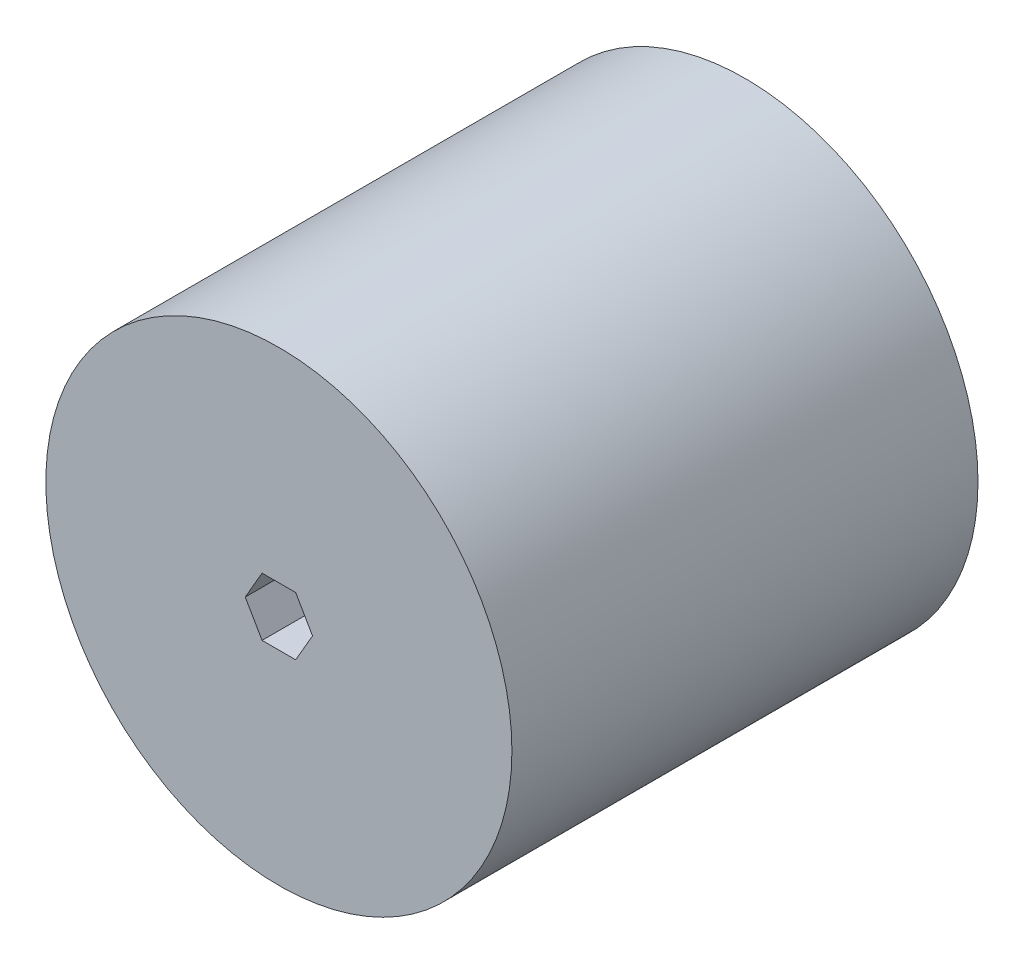
ISO-10303-21;
HEADER;
FILE_DESCRIPTION(('STEP AP214'),'2;1');
FILE_NAME('part.step','',(''),(''),'','','');
FILE_SCHEMA(('AUTOMOTIVE_DESIGN { 1 0 10303 214 1 1 1 1 }'));
ENDSEC;
DATA;
#1=APPLICATION_CONTEXT('core data for automotive mechanical design processes');
#2=APPLICATION_PROTOCOL_DEFINITION('international standard','automotive_design',2000,#1);
#3=PRODUCT_CONTEXT('',#1,'mechanical');
#4=PRODUCT('Part','Part','',(#3));
#5=PRODUCT_RELATED_PRODUCT_CATEGORY('part','',(#4));
#6=PRODUCT_DEFINITION_FORMATION('','',#4);
#7=PRODUCT_DEFINITION_CONTEXT('part definition',#1,'design');
#8=PRODUCT_DEFINITION('design','',#6,#7);
#9=PRODUCT_DEFINITION_SHAPE('','',#8);
#10=(LENGTH_UNIT() NAMED_UNIT(*) SI_UNIT(.MILLI.,.METRE.));
#11=(NAMED_UNIT(*) PLANE_ANGLE_UNIT() SI_UNIT($,.RADIAN.));
#12=(NAMED_UNIT(*) SI_UNIT($,.STERADIAN.) SOLID_ANGLE_UNIT());
#13=UNCERTAINTY_MEASURE_WITH_UNIT(LENGTH_MEASURE(1.E-05),#10,'distance_accuracy_value','');
#14=(GEOMETRIC_REPRESENTATION_CONTEXT(3) GLOBAL_UNCERTAINTY_ASSIGNED_CONTEXT((#13)) GLOBAL_UNIT_ASSIGNED_CONTEXT((#10,
#11,#12)) REPRESENTATION_CONTEXT('',''));
#15=CARTESIAN_POINT('',(0.,0.,0.));
#16=DIRECTION('',(0.,0.,1.));
#17=DIRECTION('',(1.,0.,0.));
#18=AXIS2_PLACEMENT_3D('',#15,#16,#17);
#19=CARTESIAN_POINT('',(0.,0.,101.6));
#20=DIRECTION('',(0.,0.,1.));
#21=DIRECTION('',(1.,0.,0.));
#22=AXIS2_PLACEMENT_3D('',#19,#20,#21);
#23=PLANE('',#22);
#24=CARTESIAN_POINT('',(0.,0.,101.6));
#25=DIRECTION('',(0.,0.,1.));
#26=DIRECTION('',(1.,0.,0.));
#27=AXIS2_PLACEMENT_3D('',#24,#25,#26);
#28=CIRCLE('',#27,50.8);
#29=CARTESIAN_POINT('',(50.8,0.,101.6));
#30=VERTEX_POINT('',#29);
#31=EDGE_CURVE('E11',#30,#30,#28,.T.);
#32=ORIENTED_EDGE('',*,*,#31,.T.);
#33=EDGE_LOOP('',(#32));
#34=FACE_BOUND('',#33,.T.);
#35=DIRECTION('',(0.500000000000001,-0.866025403784438,0.));
#36=VECTOR('',#35,1.);
#37=CARTESIAN_POINT('',(-7.33234841870825,0.,101.6));
#38=LINE('',#37,#36);
#39=CARTESIAN_POINT('',(-7.33234841870825,0.,101.6));
#40=VERTEX_POINT('',#39);
#41=CARTESIAN_POINT('',(-3.66617420935411,-6.35000000000001,101.6));
#42=VERTEX_POINT('',#41);
#43=EDGE_CURVE('E95',#40,#42,#38,.T.);
#44=ORIENTED_EDGE('',*,*,#43,.F.);
#45=DIRECTION('',(-0.499999999999995,-0.866025403784442,0.));
#46=VECTOR('',#45,1.);
#47=CARTESIAN_POINT('',(-3.6661742093542,6.34999999999996,101.6));
#48=LINE('',#47,#46);
#49=CARTESIAN_POINT('',(-3.6661742093542,6.34999999999996,101.6));
#50=VERTEX_POINT('',#49);
#51=EDGE_CURVE('E87',#50,#40,#48,.T.);
#52=ORIENTED_EDGE('',*,*,#51,.F.);
#53=DIRECTION('',(-1.,0.,0.));
#54=VECTOR('',#53,1.);
#55=CARTESIAN_POINT('',(3.66617420935407,6.35000000000003,101.6));
#56=LINE('',#55,#54);
#57=CARTESIAN_POINT('',(3.66617420935407,6.35000000000003,101.6));
#58=VERTEX_POINT('',#57);
#59=EDGE_CURVE('E115',#58,#50,#56,.T.);
#60=ORIENTED_EDGE('',*,*,#59,.F.);
#61=DIRECTION('',(-0.500000000000007,0.866025403784435,0.));
#62=VECTOR('',#61,1.);
#63=CARTESIAN_POINT('',(7.33234841870825,0.,101.6));
#64=LINE('',#63,#62);
#65=CARTESIAN_POINT('',(7.33234841870825,0.,101.6));
#66=VERTEX_POINT('',#65);
#67=EDGE_CURVE('E113',#66,#58,#64,.T.);
#68=ORIENTED_EDGE('',*,*,#67,.F.);
#69=DIRECTION('',(0.499999999999995,0.866025403784442,0.));
#70=VECTOR('',#69,1.);
#71=CARTESIAN_POINT('',(3.66617420935415,-6.34999999999998,101.6));
#72=LINE('',#71,#70);
#73=CARTESIAN_POINT('',(3.66617420935415,-6.34999999999998,101.6));
#74=VERTEX_POINT('',#73);
#75=EDGE_CURVE('E109',#74,#66,#72,.T.);
#76=ORIENTED_EDGE('',*,*,#75,.F.);
#77=DIRECTION('',(1.,0.,0.));
#78=VECTOR('',#77,1.);
#79=CARTESIAN_POINT('',(-3.66617420935411,-6.35000000000001,101.6));
#80=LINE('',#79,#78);
#81=EDGE_CURVE('E107',#42,#74,#80,.T.);
#82=ORIENTED_EDGE('',*,*,#81,.F.);
#83=EDGE_LOOP('',(#44,#52,#60,#68,#76,#82));
#84=FACE_BOUND('',#83,.T.);
#85=ADVANCED_FACE('F34',(#34,#84),#23,.T.);
#86=CARTESIAN_POINT('',(0.,0.,0.));
#87=DIRECTION('',(0.,0.,1.));
#88=DIRECTION('',(1.,0.,0.));
#89=AXIS2_PLACEMENT_3D('',#86,#87,#88);
#90=PLANE('',#89);
#91=CARTESIAN_POINT('',(0.,0.,0.));
#92=DIRECTION('',(0.,0.,1.));
#93=DIRECTION('',(1.,0.,0.));
#94=AXIS2_PLACEMENT_3D('',#91,#92,#93);
#95=CIRCLE('',#94,50.8);
#96=CARTESIAN_POINT('',(50.8,0.,0.));
#97=VERTEX_POINT('',#96);
#98=EDGE_CURVE('E38',#97,#97,#95,.T.);
#99=ORIENTED_EDGE('',*,*,#98,.F.);
#100=EDGE_LOOP('',(#99));
#101=FACE_BOUND('',#100,.T.);
#102=DIRECTION('',(-0.499999999999995,-0.866025403784442,0.));
#103=VECTOR('',#102,1.);
#104=CARTESIAN_POINT('',(-3.6661742093542,6.34999999999996,0.));
#105=LINE('',#104,#103);
#106=CARTESIAN_POINT('',(-3.6661742093542,6.34999999999996,0.));
#107=VERTEX_POINT('',#106);
#108=CARTESIAN_POINT('',(-7.33234841870825,0.,0.));
#109=VERTEX_POINT('',#108);
#110=EDGE_CURVE('E57',#107,#109,#105,.T.);
#111=ORIENTED_EDGE('',*,*,#110,.T.);
#112=DIRECTION('',(0.500000000000001,-0.866025403784438,0.));
#113=VECTOR('',#112,1.);
#114=CARTESIAN_POINT('',(-7.33234841870825,0.,0.));
#115=LINE('',#114,#113);
#116=CARTESIAN_POINT('',(-3.66617420935411,-6.35000000000001,0.));
#117=VERTEX_POINT('',#116);
#118=EDGE_CURVE('E102',#109,#117,#115,.T.);
#119=ORIENTED_EDGE('',*,*,#118,.T.);
#120=DIRECTION('',(1.,0.,0.));
#121=VECTOR('',#120,1.);
#122=CARTESIAN_POINT('',(-3.66617420935411,-6.35000000000001,0.));
#123=LINE('',#122,#121);
#124=CARTESIAN_POINT('',(3.66617420935415,-6.34999999999998,0.));
#125=VERTEX_POINT('',#124);
#126=EDGE_CURVE('E119',#117,#125,#123,.T.);
#127=ORIENTED_EDGE('',*,*,#126,.T.);
#128=DIRECTION('',(0.499999999999995,0.866025403784442,0.));
#129=VECTOR('',#128,1.);
#130=CARTESIAN_POINT('',(3.66617420935415,-6.34999999999998,0.));
#131=LINE('',#130,#129);
#132=CARTESIAN_POINT('',(7.33234841870825,0.,0.));
#133=VERTEX_POINT('',#132);
#134=EDGE_CURVE('E122',#125,#133,#131,.T.);
#135=ORIENTED_EDGE('',*,*,#134,.T.);
#136=DIRECTION('',(-0.500000000000007,0.866025403784435,0.));
#137=VECTOR('',#136,1.);
#138=CARTESIAN_POINT('',(7.33234841870825,0.,0.));
#139=LINE('',#138,#137);
#140=CARTESIAN_POINT('',(3.66617420935407,6.35000000000003,0.));
#141=VERTEX_POINT('',#140);
#142=EDGE_CURVE('E125',#133,#141,#139,.T.);
#143=ORIENTED_EDGE('',*,*,#142,.T.);
#144=DIRECTION('',(-1.,0.,0.));
#145=VECTOR('',#144,1.);
#146=CARTESIAN_POINT('',(3.66617420935407,6.35000000000003,0.));
#147=LINE('',#146,#145);
#148=EDGE_CURVE('E96',#141,#107,#147,.T.);
#149=ORIENTED_EDGE('',*,*,#148,.T.);
#150=EDGE_LOOP('',(#111,#119,#127,#135,#143,#149));
#151=FACE_BOUND('',#150,.T.);
#152=ADVANCED_FACE('F142',(#101,#151),#90,.F.);
#153=CARTESIAN_POINT('',(0.,0.,101.6));
#154=DIRECTION('',(0.,0.,-1.));
#155=DIRECTION('',(-1.,0.,0.));
#156=AXIS2_PLACEMENT_3D('',#153,#154,#155);
#157=CYLINDRICAL_SURFACE('',#156,50.8);
#158=ORIENTED_EDGE('',*,*,#31,.F.);
#159=EDGE_LOOP('',(#158));
#160=FACE_BOUND('',#159,.T.);
#161=ORIENTED_EDGE('',*,*,#98,.T.);
#162=EDGE_LOOP('',(#161));
#163=FACE_BOUND('',#162,.T.);
#164=ADVANCED_FACE('F36',(#160,#163),#157,.T.);
#165=CARTESIAN_POINT('',(-3.6661742093542,6.34999999999996,101.6));
#166=DIRECTION('',(0.866025403784442,-0.499999999999995,0.));
#167=DIRECTION('',(0.499999999999995,0.866025403784442,0.));
#168=AXIS2_PLACEMENT_3D('',#165,#166,#167);
#169=PLANE('',#168);
#170=ORIENTED_EDGE('',*,*,#110,.F.);
#171=DIRECTION('',(0.,0.,-1.));
#172=VECTOR('',#171,1.);
#173=CARTESIAN_POINT('',(-3.6661742093542,6.34999999999996,101.6));
#174=LINE('',#173,#172);
#175=EDGE_CURVE('E91',#50,#107,#174,.T.);
#176=ORIENTED_EDGE('',*,*,#175,.F.);
#177=ORIENTED_EDGE('',*,*,#51,.T.);
#178=DIRECTION('',(0.,0.,-1.));
#179=VECTOR('',#178,1.);
#180=CARTESIAN_POINT('',(-7.33234841870825,0.,101.6));
#181=LINE('',#180,#179);
#182=EDGE_CURVE('E90',#40,#109,#181,.T.);
#183=ORIENTED_EDGE('',*,*,#182,.T.);
#184=EDGE_LOOP('',(#170,#176,#177,#183));
#185=FACE_BOUND('',#184,.T.);
#186=ADVANCED_FACE('F89',(#185),#169,.T.);
#187=CARTESIAN_POINT('',(-7.33234841870825,0.,101.6));
#188=DIRECTION('',(0.866025403784438,0.500000000000001,0.));
#189=DIRECTION('',(-0.500000000000001,0.866025403784438,0.));
#190=AXIS2_PLACEMENT_3D('',#187,#188,#189);
#191=PLANE('',#190);
#192=ORIENTED_EDGE('',*,*,#118,.F.);
#193=ORIENTED_EDGE('',*,*,#182,.F.);
#194=ORIENTED_EDGE('',*,*,#43,.T.);
#195=DIRECTION('',(0.,0.,-1.));
#196=VECTOR('',#195,1.);
#197=CARTESIAN_POINT('',(-3.66617420935411,-6.35000000000001,101.6));
#198=LINE('',#197,#196);
#199=EDGE_CURVE('E103',#42,#117,#198,.T.);
#200=ORIENTED_EDGE('',*,*,#199,.T.);
#201=EDGE_LOOP('',(#192,#193,#194,#200));
#202=FACE_BOUND('',#201,.T.);
#203=ADVANCED_FACE('F99',(#202),#191,.T.);
#204=CARTESIAN_POINT('',(-3.66617420935411,-6.35000000000001,101.6));
#205=DIRECTION('',(0.,1.,0.));
#206=DIRECTION('',(-1.,0.,0.));
#207=AXIS2_PLACEMENT_3D('',#204,#205,#206);
#208=PLANE('',#207);
#209=ORIENTED_EDGE('',*,*,#126,.F.);
#210=ORIENTED_EDGE('',*,*,#199,.F.);
#211=ORIENTED_EDGE('',*,*,#81,.T.);
#212=DIRECTION('',(0.,0.,-1.));
#213=VECTOR('',#212,1.);
#214=CARTESIAN_POINT('',(3.66617420935415,-6.34999999999998,101.6));
#215=LINE('',#214,#213);
#216=EDGE_CURVE('E134',#74,#125,#215,.T.);
#217=ORIENTED_EDGE('',*,*,#216,.T.);
#218=EDGE_LOOP('',(#209,#210,#211,#217));
#219=FACE_BOUND('',#218,.T.);
#220=ADVANCED_FACE('F138',(#219),#208,.T.);
#221=CARTESIAN_POINT('',(3.66617420935415,-6.34999999999998,101.6));
#222=DIRECTION('',(-0.866025403784441,0.499999999999995,0.));
#223=DIRECTION('',(-0.499999999999995,-0.866025403784442,0.));
#224=AXIS2_PLACEMENT_3D('',#221,#222,#223);
#225=PLANE('',#224);
#226=ORIENTED_EDGE('',*,*,#134,.F.);
#227=ORIENTED_EDGE('',*,*,#216,.F.);
#228=ORIENTED_EDGE('',*,*,#75,.T.);
#229=DIRECTION('',(0.,0.,-1.));
#230=VECTOR('',#229,1.);
#231=CARTESIAN_POINT('',(7.33234841870825,0.,101.6));
#232=LINE('',#231,#230);
#233=EDGE_CURVE('E132',#66,#133,#232,.T.);
#234=ORIENTED_EDGE('',*,*,#233,.T.);
#235=EDGE_LOOP('',(#226,#227,#228,#234));
#236=FACE_BOUND('',#235,.T.);
#237=ADVANCED_FACE('F150',(#236),#225,.T.);
#238=CARTESIAN_POINT('',(7.33234841870825,0.,101.6));
#239=DIRECTION('',(-0.866025403784434,-0.500000000000007,0.));
#240=DIRECTION('',(0.500000000000007,-0.866025403784435,0.));
#241=AXIS2_PLACEMENT_3D('',#238,#239,#240);
#242=PLANE('',#241);
#243=ORIENTED_EDGE('',*,*,#142,.F.);
#244=ORIENTED_EDGE('',*,*,#233,.F.);
#245=ORIENTED_EDGE('',*,*,#67,.T.);
#246=DIRECTION('',(0.,0.,-1.));
#247=VECTOR('',#246,1.);
#248=CARTESIAN_POINT('',(3.66617420935407,6.35000000000003,101.6));
#249=LINE('',#248,#247);
#250=EDGE_CURVE('E49',#58,#141,#249,.T.);
#251=ORIENTED_EDGE('',*,*,#250,.T.);
#252=EDGE_LOOP('',(#243,#244,#245,#251));
#253=FACE_BOUND('',#252,.T.);
#254=ADVANCED_FACE('F148',(#253),#242,.T.);
#255=CARTESIAN_POINT('',(3.66617420935407,6.35000000000003,101.6));
#256=DIRECTION('',(0.,-1.,0.));
#257=DIRECTION('',(1.,0.,0.));
#258=AXIS2_PLACEMENT_3D('',#255,#256,#257);
#259=PLANE('',#258);
#260=ORIENTED_EDGE('',*,*,#148,.F.);
#261=ORIENTED_EDGE('',*,*,#250,.F.);
#262=ORIENTED_EDGE('',*,*,#59,.T.);
#263=ORIENTED_EDGE('',*,*,#175,.T.);
#264=EDGE_LOOP('',(#260,#261,#262,#263));
#265=FACE_BOUND('',#264,.T.);
#266=ADVANCED_FACE('F144',(#265),#259,.T.);
#267=CLOSED_SHELL('',(#85,#152,#164,#186,#203,#220,#237,#254,#266));
#268=MANIFOLD_SOLID_BREP('B2',#267);
#269=ADVANCED_BREP_SHAPE_REPRESENTATION('',(#18,#268),#14);
#270=SHAPE_DEFINITION_REPRESENTATION(#9,#269);
ENDSEC;
END-ISO-10303-21;
